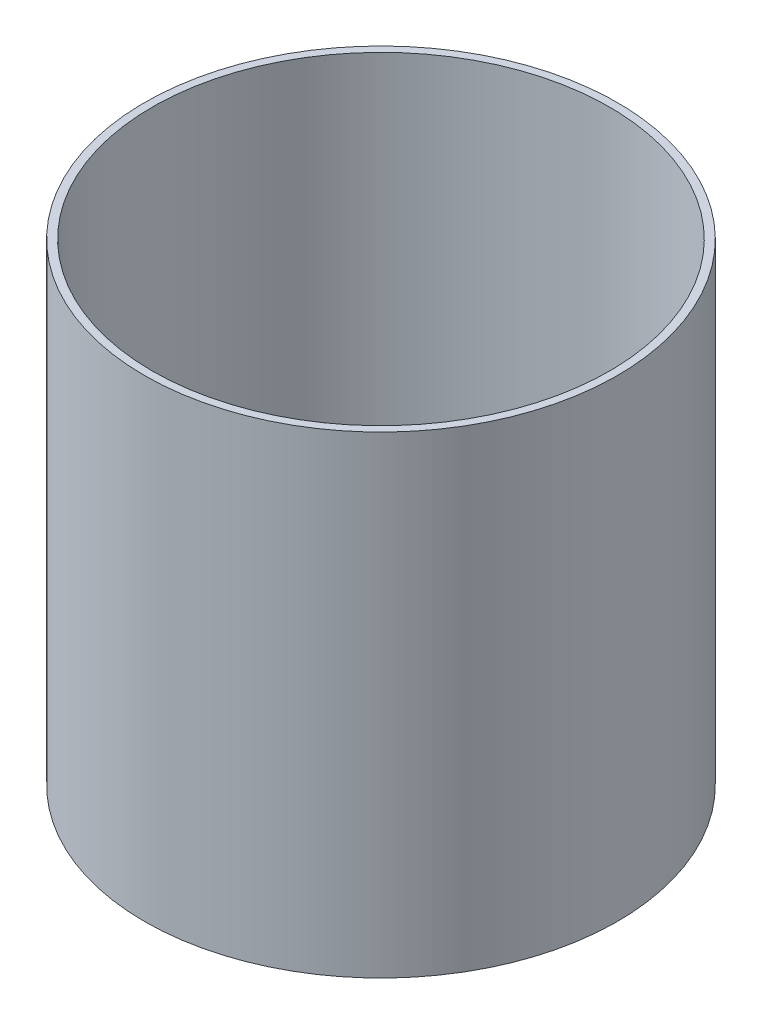
ISO-10303-21;
HEADER;
FILE_DESCRIPTION(('STEP AP214'),'2;1');
FILE_NAME('part.step','',(''),(''),'','','');
FILE_SCHEMA(('AUTOMOTIVE_DESIGN { 1 0 10303 214 1 1 1 1 }'));
ENDSEC;
DATA;
#1=APPLICATION_CONTEXT('core data for automotive mechanical design processes');
#2=APPLICATION_PROTOCOL_DEFINITION('international standard','automotive_design',2000,#1);
#3=PRODUCT_CONTEXT('',#1,'mechanical');
#4=PRODUCT('Part','Part','',(#3));
#5=PRODUCT_RELATED_PRODUCT_CATEGORY('part','',(#4));
#6=PRODUCT_DEFINITION_FORMATION('','',#4);
#7=PRODUCT_DEFINITION_CONTEXT('part definition',#1,'design');
#8=PRODUCT_DEFINITION('design','',#6,#7);
#9=PRODUCT_DEFINITION_SHAPE('','',#8);
#10=(LENGTH_UNIT() NAMED_UNIT(*) SI_UNIT(.MILLI.,.METRE.));
#11=(NAMED_UNIT(*) PLANE_ANGLE_UNIT() SI_UNIT($,.RADIAN.));
#12=(NAMED_UNIT(*) SI_UNIT($,.STERADIAN.) SOLID_ANGLE_UNIT());
#13=UNCERTAINTY_MEASURE_WITH_UNIT(LENGTH_MEASURE(1.E-05),#10,'distance_accuracy_value','');
#14=(GEOMETRIC_REPRESENTATION_CONTEXT(3) GLOBAL_UNCERTAINTY_ASSIGNED_CONTEXT((#13)) GLOBAL_UNIT_ASSIGNED_CONTEXT((#10,
#11,#12)) REPRESENTATION_CONTEXT('',''));
#15=CARTESIAN_POINT('',(0.,0.,0.));
#16=DIRECTION('',(0.,0.,1.));
#17=DIRECTION('',(1.,0.,0.));
#18=AXIS2_PLACEMENT_3D('',#15,#16,#17);
#19=CARTESIAN_POINT('',(0.,152.,0.));
#20=DIRECTION('',(0.,1.,0.));
#21=DIRECTION('',(0.,0.,1.));
#22=AXIS2_PLACEMENT_3D('',#19,#20,#21);
#23=PLANE('',#22);
#24=CARTESIAN_POINT('',(0.,152.,0.));
#25=DIRECTION('',(0.,1.,0.));
#26=DIRECTION('',(0.,0.,1.));
#27=AXIS2_PLACEMENT_3D('',#24,#25,#26);
#28=CIRCLE('',#27,76.);
#29=CARTESIAN_POINT('',(0.,152.,76.));
#30=VERTEX_POINT('',#29);
#31=EDGE_CURVE('E10',#30,#30,#28,.T.);
#32=ORIENTED_EDGE('',*,*,#31,.T.);
#33=EDGE_LOOP('',(#32));
#34=FACE_BOUND('',#33,.T.);
#35=CARTESIAN_POINT('',(0.,152.,0.));
#36=DIRECTION('',(0.,1.,0.));
#37=DIRECTION('',(0.,0.,1.));
#38=AXIS2_PLACEMENT_3D('',#35,#36,#37);
#39=CIRCLE('',#38,73.5);
#40=CARTESIAN_POINT('',(0.,152.,73.5));
#41=VERTEX_POINT('',#40);
#42=EDGE_CURVE('E48',#41,#41,#39,.T.);
#43=ORIENTED_EDGE('',*,*,#42,.F.);
#44=EDGE_LOOP('',(#43));
#45=FACE_BOUND('',#44,.T.);
#46=ADVANCED_FACE('F37',(#34,#45),#23,.T.);
#47=CARTESIAN_POINT('',(0.,0.,0.));
#48=DIRECTION('',(0.,1.,0.));
#49=DIRECTION('',(0.,0.,1.));
#50=AXIS2_PLACEMENT_3D('',#47,#48,#49);
#51=PLANE('',#50);
#52=CARTESIAN_POINT('',(0.,0.,0.));
#53=DIRECTION('',(0.,1.,0.));
#54=DIRECTION('',(0.,0.,1.));
#55=AXIS2_PLACEMENT_3D('',#52,#53,#54);
#56=CIRCLE('',#55,76.);
#57=CARTESIAN_POINT('',(0.,0.,76.));
#58=VERTEX_POINT('',#57);
#59=EDGE_CURVE('E41',#58,#58,#56,.T.);
#60=ORIENTED_EDGE('',*,*,#59,.F.);
#61=EDGE_LOOP('',(#60));
#62=FACE_BOUND('',#61,.T.);
#63=CARTESIAN_POINT('',(0.,0.,0.));
#64=DIRECTION('',(0.,1.,0.));
#65=DIRECTION('',(0.,0.,1.));
#66=AXIS2_PLACEMENT_3D('',#63,#64,#65);
#67=CIRCLE('',#66,73.5);
#68=CARTESIAN_POINT('',(0.,0.,73.5));
#69=VERTEX_POINT('',#68);
#70=EDGE_CURVE('E50',#69,#69,#67,.T.);
#71=ORIENTED_EDGE('',*,*,#70,.T.);
#72=EDGE_LOOP('',(#71));
#73=FACE_BOUND('',#72,.T.);
#74=ADVANCED_FACE('F60',(#62,#73),#51,.F.);
#75=CARTESIAN_POINT('',(0.,152.,0.));
#76=DIRECTION('',(0.,-1.,0.));
#77=DIRECTION('',(0.,0.,-1.));
#78=AXIS2_PLACEMENT_3D('',#75,#76,#77);
#79=CYLINDRICAL_SURFACE('',#78,76.);
#80=ORIENTED_EDGE('',*,*,#31,.F.);
#81=EDGE_LOOP('',(#80));
#82=FACE_BOUND('',#81,.T.);
#83=ORIENTED_EDGE('',*,*,#59,.T.);
#84=EDGE_LOOP('',(#83));
#85=FACE_BOUND('',#84,.T.);
#86=ADVANCED_FACE('F39',(#82,#85),#79,.T.);
#87=CARTESIAN_POINT('',(0.,152.,0.));
#88=DIRECTION('',(0.,-1.,0.));
#89=DIRECTION('',(0.,0.,-1.));
#90=AXIS2_PLACEMENT_3D('',#87,#88,#89);
#91=CYLINDRICAL_SURFACE('',#90,73.5);
#92=ORIENTED_EDGE('',*,*,#42,.T.);
#93=EDGE_LOOP('',(#92));
#94=FACE_BOUND('',#93,.T.);
#95=ORIENTED_EDGE('',*,*,#70,.F.);
#96=EDGE_LOOP('',(#95));
#97=FACE_BOUND('',#96,.T.);
#98=ADVANCED_FACE('F56',(#94,#97),#91,.F.);
#99=CLOSED_SHELL('',(#46,#74,#86,#98));
#100=MANIFOLD_SOLID_BREP('B2',#99);
#101=ADVANCED_BREP_SHAPE_REPRESENTATION('',(#18,#100),#14);
#102=SHAPE_DEFINITION_REPRESENTATION(#9,#101);
ENDSEC;
END-ISO-10303-21;
